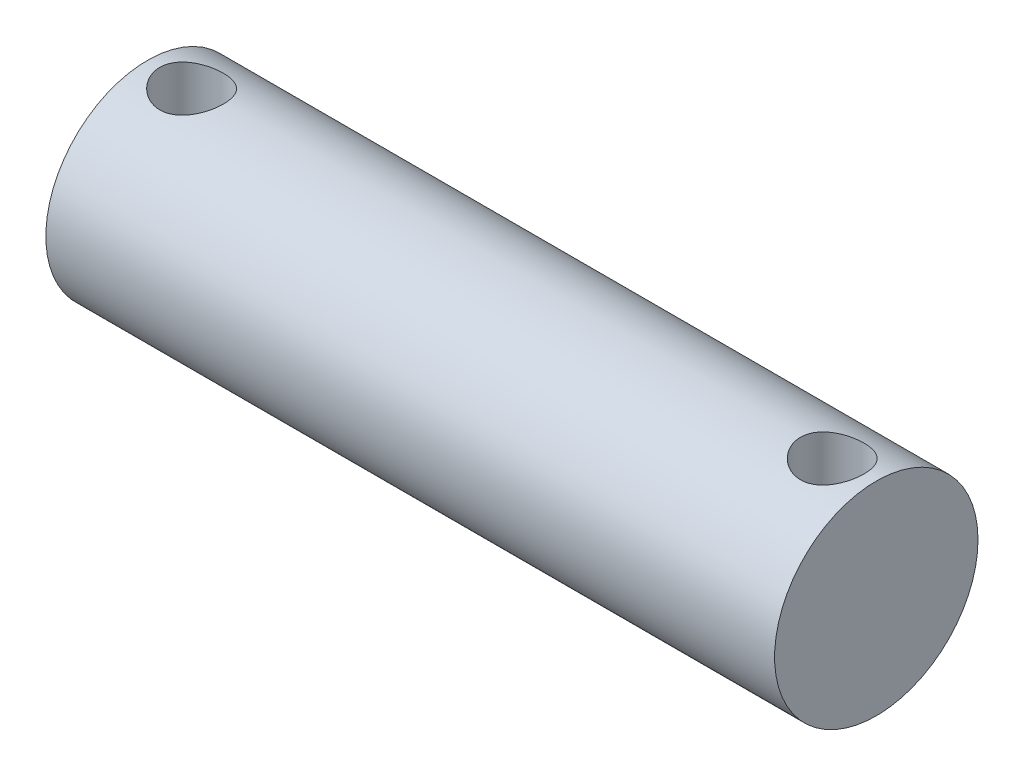
ISO-10303-21;
HEADER;
FILE_DESCRIPTION(('STEP AP214'),'2;1');
FILE_NAME('part.step','',(''),(''),'','','');
FILE_SCHEMA(('AUTOMOTIVE_DESIGN { 1 0 10303 214 1 1 1 1 }'));
ENDSEC;
DATA;
#1=APPLICATION_CONTEXT('core data for automotive mechanical design processes');
#2=APPLICATION_PROTOCOL_DEFINITION('international standard','automotive_design',2000,#1);
#3=PRODUCT_CONTEXT('',#1,'mechanical');
#4=PRODUCT('Part','Part','',(#3));
#5=PRODUCT_RELATED_PRODUCT_CATEGORY('part','',(#4));
#6=PRODUCT_DEFINITION_FORMATION('','',#4);
#7=PRODUCT_DEFINITION_CONTEXT('part definition',#1,'design');
#8=PRODUCT_DEFINITION('design','',#6,#7);
#9=PRODUCT_DEFINITION_SHAPE('','',#8);
#10=(LENGTH_UNIT() NAMED_UNIT(*) SI_UNIT(.MILLI.,.METRE.));
#11=(NAMED_UNIT(*) PLANE_ANGLE_UNIT() SI_UNIT($,.RADIAN.));
#12=(NAMED_UNIT(*) SI_UNIT($,.STERADIAN.) SOLID_ANGLE_UNIT());
#13=UNCERTAINTY_MEASURE_WITH_UNIT(LENGTH_MEASURE(1.E-05),#10,'distance_accuracy_value','');
#14=(GEOMETRIC_REPRESENTATION_CONTEXT(3) GLOBAL_UNCERTAINTY_ASSIGNED_CONTEXT((#13)) GLOBAL_UNIT_ASSIGNED_CONTEXT((#10,
#11,#12)) REPRESENTATION_CONTEXT('',''));
#15=CARTESIAN_POINT('',(0.,0.,0.));
#16=DIRECTION('',(0.,0.,1.));
#17=DIRECTION('',(1.,0.,0.));
#18=AXIS2_PLACEMENT_3D('',#15,#16,#17);
#19=CARTESIAN_POINT('',(91.,0.,0.));
#20=DIRECTION('',(-1.,0.,0.));
#21=DIRECTION('',(0.,0.,1.));
#22=AXIS2_PLACEMENT_3D('',#19,#20,#21);
#23=CYLINDRICAL_SURFACE('',#22,12.7);
#24=CARTESIAN_POINT('',(85.5,-12.0639555468967,3.96875));
#25=CARTESIAN_POINT('',(85.7170018396472,-12.0639568842915,3.9687485325165));
#26=CARTESIAN_POINT('',(85.9340185906327,-12.0698746252851,3.95089185662996));
#27=CARTESIAN_POINT('',(86.3616764607871,-12.0928015382143,3.88014131899213));
#28=CARTESIAN_POINT('',(86.5723158409246,-12.1098137074621,3.82723798884486));
#29=CARTESIAN_POINT('',(86.9809625636341,-12.1528185580417,3.688390776098));
#30=CARTESIAN_POINT('',(87.1789915401105,-12.1787953399196,3.60250535963949));
#31=CARTESIAN_POINT('',(87.5578848093683,-12.2367803974434,3.40032702499773));
#32=CARTESIAN_POINT('',(87.7387460621234,-12.2687897383379,3.28402873500381));
#33=CARTESIAN_POINT('',(88.0843829042918,-12.3364665534787,3.02004752422577));
#34=CARTESIAN_POINT('',(88.2484819599593,-12.3722169174668,2.87149984411226));
#35=CARTESIAN_POINT('',(88.5498923419392,-12.4426423060657,2.54908699749619));
#36=CARTESIAN_POINT('',(88.6871999277999,-12.4773171799559,2.37521830174644));
#37=CARTESIAN_POINT('',(88.9341151250607,-12.542632820135,2.00223727216642));
#38=CARTESIAN_POINT('',(89.0430260096649,-12.5731646098683,1.8026429419513));
#39=CARTESIAN_POINT('',(89.2254689582914,-12.6257860206983,1.38685343930955));
#40=CARTESIAN_POINT('',(89.299009337925,-12.6478776258325,1.17066218269639));
#41=CARTESIAN_POINT('',(89.4063648317082,-12.6805428323124,0.734899333367359));
#42=CARTESIAN_POINT('',(89.4413362555764,-12.6914509627465,0.515638146611583));
#43=CARTESIAN_POINT('',(89.4742247999392,-12.7017016690635,0.0741070844008447));
#44=CARTESIAN_POINT('',(89.4721503435893,-12.7010468740197,-0.148162095639555));
#45=CARTESIAN_POINT('',(89.4317666742146,-12.6884784372079,-0.581261475126279));
#46=CARTESIAN_POINT('',(89.3947109573462,-12.6769542933654,-0.792221663947061));
#47=CARTESIAN_POINT('',(89.2874734066134,-12.6444210713078,-1.20476347612921));
#48=CARTESIAN_POINT('',(89.21728941235,-12.6234113745139,-1.40634448690293));
#49=CARTESIAN_POINT('',(89.0449821496875,-12.5737448464102,-1.79729797751631));
#50=CARTESIAN_POINT('',(88.9424784828133,-12.5449975673293,-1.98649083785201));
#51=CARTESIAN_POINT('',(88.7087467584371,-12.4828847037847,-2.34538047290818));
#52=CARTESIAN_POINT('',(88.5775114372341,-12.4495179522495,-2.51507230096488));
#53=CARTESIAN_POINT('',(88.2836062095093,-12.3800765457896,-2.83761719258919));
#54=CARTESIAN_POINT('',(88.1198542064422,-12.3439469905188,-2.98947379336683));
#55=CARTESIAN_POINT('',(87.7688705516943,-12.2742520403678,-3.26386743274753));
#56=CARTESIAN_POINT('',(87.5816361383756,-12.2406869478284,-3.386401017894));
#57=CARTESIAN_POINT('',(87.1861870364089,-12.1796443805944,-3.59982976435593));
#58=CARTESIAN_POINT('',(86.9777611764537,-12.1522391668376,-3.6903558622175));
#59=CARTESIAN_POINT('',(86.5475611134016,-12.1074670626035,-3.83471248377108));
#60=CARTESIAN_POINT('',(86.3257917374329,-12.090096565806,-3.8885561917888));
#61=CARTESIAN_POINT('',(85.8847466505676,-12.0681611381736,-3.95609715466836));
#62=CARTESIAN_POINT('',(85.6657286619535,-12.0631098080018,-3.97132030073624));
#63=CARTESIAN_POINT('',(85.2282525707529,-12.0650342093526,-3.96547163781534));
#64=CARTESIAN_POINT('',(85.0097943868786,-12.0720080824823,-3.94440543703716));
#65=CARTESIAN_POINT('',(84.5862086581285,-12.0967169001143,-3.86793973404382));
#66=CARTESIAN_POINT('',(84.3808783048144,-12.1141348427389,-3.81355063934748));
#67=CARTESIAN_POINT('',(83.9822808104132,-12.1574333727714,-3.67316936373721));
#68=CARTESIAN_POINT('',(83.7890156428254,-12.1833153403409,-3.58717202843405));
#69=CARTESIAN_POINT('',(83.4139008264745,-12.2415471339902,-3.38320096332414));
#70=CARTESIAN_POINT('',(83.2325375054929,-12.2740611607997,-3.26438093276173));
#71=CARTESIAN_POINT('',(82.891768150301,-12.3415535798866,-2.99912534755838));
#72=CARTESIAN_POINT('',(82.7323678386621,-12.3765326108584,-2.85268261914323));
#73=CARTESIAN_POINT('',(82.4332345882268,-12.4467679551153,-2.52911910911771));
#74=CARTESIAN_POINT('',(82.2945905290059,-12.4819756800704,-2.35097843807856));
#75=CARTESIAN_POINT('',(82.049120937455,-12.5472526500367,-1.97310865744319));
#76=CARTESIAN_POINT('',(81.9422939476875,-12.5773221303875,-1.77338053726987));
#77=CARTESIAN_POINT('',(81.7645154641524,-12.6287629037303,-1.35923503657856));
#78=CARTESIAN_POINT('',(81.6933042610963,-12.6501969360681,-1.14493733510092));
#79=CARTESIAN_POINT('',(81.5881696899777,-12.6822277040923,-0.706619281629031));
#80=CARTESIAN_POINT('',(81.5542346534099,-12.6928278310283,-0.482601994980625));
#81=CARTESIAN_POINT('',(81.525563569445,-12.7017717580917,-0.0412271738602467));
#82=CARTESIAN_POINT('',(81.5292546707078,-12.7006073586846,0.176019434430215));
#83=CARTESIAN_POINT('',(81.5719275000796,-12.6873310540733,0.60665747960632));
#84=CARTESIAN_POINT('',(81.6109069272744,-12.6752198626356,0.820049166920138));
#85=CARTESIAN_POINT('',(81.7220484792807,-12.6415663743223,1.23429750117652));
#86=CARTESIAN_POINT('',(81.7937895049091,-12.6201439227365,1.4352775410771));
#87=CARTESIAN_POINT('',(81.9680373763869,-12.5700772724174,1.82244500096279));
#88=CARTESIAN_POINT('',(82.0705494991656,-12.5414318351506,2.00862987679648));
#89=CARTESIAN_POINT('',(82.3074510077436,-12.4786992260472,2.36779338152877));
#90=CARTESIAN_POINT('',(82.4428036838231,-12.444460434593,2.54010987739363));
#91=CARTESIAN_POINT('',(82.739845148983,-12.3748398853692,2.86010601269284));
#92=CARTESIAN_POINT('',(82.9015418178926,-12.3394577881682,3.00777825387572));
#93=CARTESIAN_POINT('',(83.2531024104955,-12.2701650893337,3.27923099268228));
#94=CARTESIAN_POINT('',(83.4437220548951,-12.2363420774147,3.40205783883209));
#95=CARTESIAN_POINT('',(83.8439140318545,-12.1754939776251,3.61379994626557));
#96=CARTESIAN_POINT('',(84.0534786564796,-12.148466141849,3.70272892306259));
#97=CARTESIAN_POINT('',(84.4672443099741,-12.1064832939804,3.83765997883641));
#98=CARTESIAN_POINT('',(84.6703805881587,-12.090695752639,3.88667433985248));
#99=CARTESIAN_POINT('',(85.0823409169064,-12.0694325058162,3.95221605466117));
#100=CARTESIAN_POINT('',(85.2911635533148,-12.0639542598257,3.96875141226472));
#101=CARTESIAN_POINT('',(85.5,-12.0639555468967,3.96875));
#102=B_SPLINE_CURVE_WITH_KNOTS('',3,(#24,#25,#26,#27,#28,#29,#30,#31,#32,#33,#34,#35,#36,#37,
#38,#39,#40,#41,#42,#43,#44,#45,#46,#47,#48,#49,#50,#51,#52,#53,#54,#55,#56,#57,#58,#59,#60,#61,
#62,#63,#64,#65,#66,#67,#68,#69,#70,#71,#72,#73,#74,#75,#76,#77,#78,#79,#80,#81,#82,#83,#84,#85,
#86,#87,#88,#89,#90,#91,#92,#93,#94,#95,#96,#97,#98,#99,#100,#101),.UNSPECIFIED.,.T.,.F.,(4,2,2,
2,2,2,2,2,2,2,2,2,2,2,2,2,2,2,2,2,2,2,2,2,2,2,2,2,2,2,2,2,2,2,2,2,2,2,4),(0.,0.650234086716464,
1.30064391591467,1.9499060700765,2.59928298063673,3.26888730748912,3.93858505338066,
4.62342934734855,5.30811255551903,5.97165820002821,6.63505297547886,7.2755437092896,
7.91607621728547,8.56444834631701,9.21298458114372,9.88854826126038,10.5641914653574,
11.2473889522044,11.9303407555771,12.5858566319692,13.2412712130333,13.8777336124858,
14.5142998466167,15.1691217226574,15.8241138944544,16.5062515255927,17.1883579053947,
17.8654150975664,18.5422602910408,19.1909319775322,19.839561371558,20.4800786269208,
21.1207057872722,21.7830620061678,22.4456167093443,23.1301225072564,23.8143510505986,
24.4402722513688,25.066039186821),.UNSPECIFIED.);
#103=CARTESIAN_POINT('',(85.5,-12.0639555468967,3.96875));
#104=VERTEX_POINT('',#103);
#105=EDGE_CURVE('E35',#104,#104,#102,.T.);
#106=ORIENTED_EDGE('',*,*,#105,.T.);
#107=EDGE_LOOP('',(#106));
#108=FACE_BOUND('',#107,.T.);
#109=CARTESIAN_POINT('',(85.5,12.0639555468967,3.96875));
#110=CARTESIAN_POINT('',(85.2829981603529,12.0639568842915,3.9687485325165));
#111=CARTESIAN_POINT('',(85.0659814093673,12.0698746252851,3.95089185662996));
#112=CARTESIAN_POINT('',(84.638323539213,12.0928015382143,3.88014131899213));
#113=CARTESIAN_POINT('',(84.4276841590754,12.1098137074621,3.82723798884486));
#114=CARTESIAN_POINT('',(84.0190374363659,12.1528185580417,3.688390776098));
#115=CARTESIAN_POINT('',(83.8210084598895,12.1787953399196,3.60250535963949));
#116=CARTESIAN_POINT('',(83.4421151906318,12.2367803974434,3.40032702499773));
#117=CARTESIAN_POINT('',(83.2612539378766,12.2687897383379,3.28402873500381));
#118=CARTESIAN_POINT('',(82.9156170957082,12.3364665534787,3.02004752422577));
#119=CARTESIAN_POINT('',(82.7515180400408,12.3722169174668,2.87149984411226));
#120=CARTESIAN_POINT('',(82.4501076580608,12.4426423060657,2.54908699749619));
#121=CARTESIAN_POINT('',(82.3128000722001,12.4773171799559,2.37521830174644));
#122=CARTESIAN_POINT('',(82.0658848749393,12.542632820135,2.00223727216642));
#123=CARTESIAN_POINT('',(81.9569739903351,12.5731646098683,1.8026429419513));
#124=CARTESIAN_POINT('',(81.7745310417086,12.6257860206983,1.38685343930955));
#125=CARTESIAN_POINT('',(81.7009906620751,12.6478776258325,1.17066218269639));
#126=CARTESIAN_POINT('',(81.5936351682918,12.6805428323124,0.73489933336736));
#127=CARTESIAN_POINT('',(81.5586637444236,12.6914509627465,0.515638146611583));
#128=CARTESIAN_POINT('',(81.5257752000609,12.7017016690635,0.0741070844008444));
#129=CARTESIAN_POINT('',(81.5278496564108,12.7010468740197,-0.148162095639555));
#130=CARTESIAN_POINT('',(81.5682333257854,12.6884784372079,-0.581261475126278));
#131=CARTESIAN_POINT('',(81.6052890426538,12.6769542933654,-0.792221663947059));
#132=CARTESIAN_POINT('',(81.7125265933866,12.6444210713078,-1.20476347612921));
#133=CARTESIAN_POINT('',(81.78271058765,12.6234113745139,-1.40634448690293));
#134=CARTESIAN_POINT('',(81.9550178503125,12.5737448464102,-1.79729797751631));
#135=CARTESIAN_POINT('',(82.0575215171868,12.5449975673293,-1.98649083785201));
#136=CARTESIAN_POINT('',(82.2912532415629,12.4828847037847,-2.34538047290818));
#137=CARTESIAN_POINT('',(82.4224885627659,12.4495179522495,-2.51507230096488));
#138=CARTESIAN_POINT('',(82.7163937904907,12.3800765457896,-2.83761719258919));
#139=CARTESIAN_POINT('',(82.8801457935578,12.3439469905188,-2.98947379336683));
#140=CARTESIAN_POINT('',(83.2311294483057,12.2742520403678,-3.26386743274753));
#141=CARTESIAN_POINT('',(83.4183638616244,12.2406869478284,-3.386401017894));
#142=CARTESIAN_POINT('',(83.8138129635911,12.1796443805944,-3.59982976435594));
#143=CARTESIAN_POINT('',(84.0222388235464,12.1522391668376,-3.69035586221751));
#144=CARTESIAN_POINT('',(84.4524388865984,12.1074670626035,-3.83471248377109));
#145=CARTESIAN_POINT('',(84.6742082625672,12.090096565806,-3.8885561917888));
#146=CARTESIAN_POINT('',(85.1152533494324,12.0681611381736,-3.95609715466836));
#147=CARTESIAN_POINT('',(85.3342713380466,12.0631098080018,-3.97132030073624));
#148=CARTESIAN_POINT('',(85.7717474292471,12.0650342093526,-3.96547163781534));
#149=CARTESIAN_POINT('',(85.9902056131215,12.0720080824823,-3.94440543703716));
#150=CARTESIAN_POINT('',(86.4137913418715,12.0967169001143,-3.86793973404382));
#151=CARTESIAN_POINT('',(86.6191216951856,12.1141348427389,-3.81355063934748));
#152=CARTESIAN_POINT('',(87.0177191895868,12.1574333727713,-3.67316936373722));
#153=CARTESIAN_POINT('',(87.2109843571746,12.1833153403409,-3.58717202843405));
#154=CARTESIAN_POINT('',(87.5860991735255,12.2415471339902,-3.38320096332414));
#155=CARTESIAN_POINT('',(87.7674624945071,12.2740611607997,-3.26438093276173));
#156=CARTESIAN_POINT('',(88.108231849699,12.3415535798866,-2.99912534755837));
#157=CARTESIAN_POINT('',(88.2676321613379,12.3765326108584,-2.85268261914323));
#158=CARTESIAN_POINT('',(88.5667654117732,12.4467679551153,-2.52911910911771));
#159=CARTESIAN_POINT('',(88.7054094709941,12.4819756800704,-2.35097843807856));
#160=CARTESIAN_POINT('',(88.950879062545,12.5472526500367,-1.97310865744319));
#161=CARTESIAN_POINT('',(89.0577060523125,12.5773221303875,-1.77338053726987));
#162=CARTESIAN_POINT('',(89.2354845358476,12.6287629037303,-1.35923503657856));
#163=CARTESIAN_POINT('',(89.3066957389037,12.6501969360681,-1.14493733510092));
#164=CARTESIAN_POINT('',(89.4118303100223,12.6822277040923,-0.706619281629031));
#165=CARTESIAN_POINT('',(89.4457653465901,12.6928278310283,-0.482601994980625));
#166=CARTESIAN_POINT('',(89.4744364305551,12.7017717580917,-0.0412271738602467));
#167=CARTESIAN_POINT('',(89.4707453292922,12.7006073586846,0.176019434430215));
#168=CARTESIAN_POINT('',(89.4280724999204,12.6873310540733,0.60665747960632));
#169=CARTESIAN_POINT('',(89.3890930727256,12.6752198626356,0.820049166920138));
#170=CARTESIAN_POINT('',(89.2779515207193,12.6415663743223,1.23429750117652));
#171=CARTESIAN_POINT('',(89.2062104950909,12.6201439227365,1.4352775410771));
#172=CARTESIAN_POINT('',(89.0319626236131,12.5700772724174,1.82244500096279));
#173=CARTESIAN_POINT('',(88.9294505008344,12.5414318351506,2.00862987679648));
#174=CARTESIAN_POINT('',(88.6925489922564,12.4786992260472,2.36779338152877));
#175=CARTESIAN_POINT('',(88.5571963161769,12.444460434593,2.54010987739364));
#176=CARTESIAN_POINT('',(88.260154851017,12.3748398853692,2.86010601269285));
#177=CARTESIAN_POINT('',(88.0984581821074,12.3394577881682,3.00777825387572));
#178=CARTESIAN_POINT('',(87.7468975895045,12.2701650893337,3.27923099268228));
#179=CARTESIAN_POINT('',(87.5562779451049,12.2363420774147,3.40205783883209));
#180=CARTESIAN_POINT('',(87.1560859681455,12.1754939776251,3.61379994626557));
#181=CARTESIAN_POINT('',(86.9465213435204,12.148466141849,3.70272892306259));
#182=CARTESIAN_POINT('',(86.5327556900259,12.1064832939804,3.83765997883641));
#183=CARTESIAN_POINT('',(86.3296194118413,12.090695752639,3.88667433985248));
#184=CARTESIAN_POINT('',(85.9176590830937,12.0694325058162,3.95221605466117));
#185=CARTESIAN_POINT('',(85.7088364466853,12.0639542598257,3.96875141226472));
#186=CARTESIAN_POINT('',(85.5,12.0639555468967,3.96875));
#187=B_SPLINE_CURVE_WITH_KNOTS('',3,(#109,#110,#111,#112,#113,#114,#115,#116,#117,#118,#119,
#120,#121,#122,#123,#124,#125,#126,#127,#128,#129,#130,#131,#132,#133,#134,#135,#136,#137,#138,
#139,#140,#141,#142,#143,#144,#145,#146,#147,#148,#149,#150,#151,#152,#153,#154,#155,#156,#157,
#158,#159,#160,#161,#162,#163,#164,#165,#166,#167,#168,#169,#170,#171,#172,#173,#174,#175,#176,
#177,#178,#179,#180,#181,#182,#183,#184,#185,#186),.UNSPECIFIED.,.T.,.F.,(4,2,2,2,2,2,2,2,2,2,2,
2,2,2,2,2,2,2,2,2,2,2,2,2,2,2,2,2,2,2,2,2,2,2,2,2,2,2,4),(0.,0.650234086716464,1.30064391591467,
1.9499060700765,2.59928298063673,3.26888730748912,3.93858505338066,4.62342934734854,
5.30811255551903,5.9716582000282,6.63505297547885,7.27554370928959,7.91607621728547,
8.56444834631701,9.21298458114372,9.88854826126038,10.5641914653574,11.2473889522045,
11.9303407555771,12.5858566319692,13.2412712130333,13.8777336124858,14.5142998466167,
15.1691217226574,15.8241138944544,16.5062515255927,17.1883579053947,17.8654150975664,
18.5422602910408,19.1909319775322,19.839561371558,20.4800786269208,21.1207057872722,
21.7830620061678,22.4456167093443,23.1301225072564,23.8143510505986,24.4402722513687,
25.066039186821),.UNSPECIFIED.);
#188=CARTESIAN_POINT('',(85.5,12.0639555468967,3.96875));
#189=VERTEX_POINT('',#188);
#190=EDGE_CURVE('E84',#189,#189,#187,.T.);
#191=ORIENTED_EDGE('',*,*,#190,.T.);
#192=EDGE_LOOP('',(#191));
#193=FACE_BOUND('',#192,.T.);
#194=CARTESIAN_POINT('',(5.5,-12.0639555468967,3.96875));
#195=CARTESIAN_POINT('',(5.71700183964714,-12.0639568842915,3.96874853251649));
#196=CARTESIAN_POINT('',(5.93401859063266,-12.0698746252851,3.95089185662995));
#197=CARTESIAN_POINT('',(6.36167646078704,-12.0928015382143,3.88014131899213));
#198=CARTESIAN_POINT('',(6.57231584092461,-12.1098137074621,3.82723798884485));
#199=CARTESIAN_POINT('',(6.9809625636341,-12.1528185580417,3.68839077609799));
#200=CARTESIAN_POINT('',(7.17899154011053,-12.1787953399196,3.60250535963949));
#201=CARTESIAN_POINT('',(7.55788480936824,-12.2367803974434,3.40032702499773));
#202=CARTESIAN_POINT('',(7.73874606212339,-12.2687897383379,3.28402873500381));
#203=CARTESIAN_POINT('',(8.08438290429182,-12.3364665534787,3.02004752422578));
#204=CARTESIAN_POINT('',(8.24848195995925,-12.3722169174668,2.87149984411227));
#205=CARTESIAN_POINT('',(8.54989234193916,-12.4426423060657,2.5490869974962));
#206=CARTESIAN_POINT('',(8.68719992779988,-12.4773171799559,2.37521830174644));
#207=CARTESIAN_POINT('',(8.9341151250607,-12.542632820135,2.00223727216643));
#208=CARTESIAN_POINT('',(9.04302600966487,-12.5731646098683,1.8026429419513));
#209=CARTESIAN_POINT('',(9.22546895829137,-12.6257860206983,1.38685343930956));
#210=CARTESIAN_POINT('',(9.29900933792493,-12.6478776258325,1.17066218269639));
#211=CARTESIAN_POINT('',(9.40636483170819,-12.6805428323124,0.734899333367363));
#212=CARTESIAN_POINT('',(9.44133625557643,-12.6914509627465,0.515638146611587));
#213=CARTESIAN_POINT('',(9.47422479993914,-12.7017016690635,0.074107084400851));
#214=CARTESIAN_POINT('',(9.47215034358927,-12.7010468740197,-0.148162095639548));
#215=CARTESIAN_POINT('',(9.43176667421464,-12.6884784372079,-0.581261475126271));
#216=CARTESIAN_POINT('',(9.39471095734622,-12.6769542933654,-0.792221663947053));
#217=CARTESIAN_POINT('',(9.28747340661341,-12.6444210713078,-1.2047634761292));
#218=CARTESIAN_POINT('',(9.21728941234996,-12.6234113745139,-1.40634448690292));
#219=CARTESIAN_POINT('',(9.04498214968748,-12.5737448464102,-1.7972979775163));
#220=CARTESIAN_POINT('',(8.94247848281326,-12.5449975673293,-1.986490837852));
#221=CARTESIAN_POINT('',(8.70874675843714,-12.4828847037847,-2.34538047290818));
#222=CARTESIAN_POINT('',(8.57751143723408,-12.4495179522495,-2.51507230096487));
#223=CARTESIAN_POINT('',(8.28360620950933,-12.3800765457896,-2.83761719258918));
#224=CARTESIAN_POINT('',(8.11985420644223,-12.3439469905188,-2.98947379336682));
#225=CARTESIAN_POINT('',(7.76887055169429,-12.2742520403678,-3.26386743274752));
#226=CARTESIAN_POINT('',(7.58163613837563,-12.2406869478284,-3.38640101789399));
#227=CARTESIAN_POINT('',(7.18618703640896,-12.1796443805944,-3.59982976435593));
#228=CARTESIAN_POINT('',(6.97776117645367,-12.1522391668376,-3.69035586221749));
#229=CARTESIAN_POINT('',(6.54756111340163,-12.1074670626035,-3.83471248377107));
#230=CARTESIAN_POINT('',(6.32579173743286,-12.090096565806,-3.8885561917888));
#231=CARTESIAN_POINT('',(5.88474665056758,-12.0681611381736,-3.95609715466835));
#232=CARTESIAN_POINT('',(5.66572866195345,-12.0631098080018,-3.97132030073623));
#233=CARTESIAN_POINT('',(5.22825257075294,-12.0650342093526,-3.96547163781533));
#234=CARTESIAN_POINT('',(5.00979438687856,-12.0720080824823,-3.94440543703716));
#235=CARTESIAN_POINT('',(4.58620865812856,-12.0967169001143,-3.86793973404382));
#236=CARTESIAN_POINT('',(4.38087830481441,-12.1141348427389,-3.81355063934748));
#237=CARTESIAN_POINT('',(3.98228081041323,-12.1574333727714,-3.67316936373722));
#238=CARTESIAN_POINT('',(3.7890156428254,-12.1833153403409,-3.58717202843405));
#239=CARTESIAN_POINT('',(3.41390082647451,-12.2415471339902,-3.38320096332414));
#240=CARTESIAN_POINT('',(3.23253750549289,-12.2740611607997,-3.26438093276173));
#241=CARTESIAN_POINT('',(2.89176815030096,-12.3415535798866,-2.99912534755837));
#242=CARTESIAN_POINT('',(2.73236783866207,-12.3765326108584,-2.85268261914323));
#243=CARTESIAN_POINT('',(2.4332345882268,-12.4467679551153,-2.5291191091177));
#244=CARTESIAN_POINT('',(2.29459052900593,-12.4819756800704,-2.35097843807856));
#245=CARTESIAN_POINT('',(2.04912093745502,-12.5472526500367,-1.97310865744319));
#246=CARTESIAN_POINT('',(1.94229394768746,-12.5773221303875,-1.77338053726988));
#247=CARTESIAN_POINT('',(1.76451546415241,-12.6287629037303,-1.35923503657857));
#248=CARTESIAN_POINT('',(1.69330426109631,-12.6501969360681,-1.14493733510093));
#249=CARTESIAN_POINT('',(1.58816968997768,-12.6822277040923,-0.706619281629038));
#250=CARTESIAN_POINT('',(1.5542346534099,-12.6928278310283,-0.482601994980634));
#251=CARTESIAN_POINT('',(1.52556356944495,-12.7017717580917,-0.041227173860258));
#252=CARTESIAN_POINT('',(1.52925467070784,-12.7006073586846,0.176019434430203));
#253=CARTESIAN_POINT('',(1.57192750007961,-12.6873310540733,0.606657479606308));
#254=CARTESIAN_POINT('',(1.61090692727443,-12.6752198626356,0.820049166920125));
#255=CARTESIAN_POINT('',(1.72204847928072,-12.6415663743223,1.23429750117651));
#256=CARTESIAN_POINT('',(1.79378950490905,-12.6201439227365,1.4352775410771));
#257=CARTESIAN_POINT('',(1.96803737638691,-12.5700772724174,1.82244500096279));
#258=CARTESIAN_POINT('',(2.07054949916563,-12.5414318351506,2.00862987679648));
#259=CARTESIAN_POINT('',(2.30745100774359,-12.4786992260472,2.36779338152876));
#260=CARTESIAN_POINT('',(2.44280368382311,-12.444460434593,2.54010987739362));
#261=CARTESIAN_POINT('',(2.739845148983,-12.3748398853692,2.86010601269283));
#262=CARTESIAN_POINT('',(2.90154181789255,-12.3394577881682,3.00777825387571));
#263=CARTESIAN_POINT('',(3.25310241049549,-12.2701650893337,3.27923099268227));
#264=CARTESIAN_POINT('',(3.44372205489512,-12.2363420774147,3.40205783883207));
#265=CARTESIAN_POINT('',(3.84391403185452,-12.1754939776251,3.61379994626556));
#266=CARTESIAN_POINT('',(4.05347865647954,-12.148466141849,3.70272892306258));
#267=CARTESIAN_POINT('',(4.46724430997408,-12.1064832939804,3.8376599788364));
#268=CARTESIAN_POINT('',(4.67038058815872,-12.090695752639,3.88667433985248));
#269=CARTESIAN_POINT('',(5.08234091690635,-12.0694325058162,3.95221605466116));
#270=CARTESIAN_POINT('',(5.29116355331476,-12.0639542598257,3.96875141226471));
#271=CARTESIAN_POINT('',(5.5,-12.0639555468967,3.96875));
#272=B_SPLINE_CURVE_WITH_KNOTS('',3,(#194,#195,#196,#197,#198,#199,#200,#201,#202,#203,#204,
#205,#206,#207,#208,#209,#210,#211,#212,#213,#214,#215,#216,#217,#218,#219,#220,#221,#222,#223,
#224,#225,#226,#227,#228,#229,#230,#231,#232,#233,#234,#235,#236,#237,#238,#239,#240,#241,#242,
#243,#244,#245,#246,#247,#248,#249,#250,#251,#252,#253,#254,#255,#256,#257,#258,#259,#260,#261,
#262,#263,#264,#265,#266,#267,#268,#269,#270,#271),.UNSPECIFIED.,.T.,.F.,(4,2,2,2,2,2,2,2,2,2,2,
2,2,2,2,2,2,2,2,2,2,2,2,2,2,2,2,2,2,2,2,2,2,2,2,2,2,2,4),(0.,0.650234086716456,1.30064391591466,
1.9499060700765,2.59928298063671,3.26888730748911,3.93858505338064,4.62342934734852,
5.30811255551902,5.97165820002819,6.63505297547884,7.27554370928958,7.91607621728546,
8.56444834631698,9.2129845811437,9.88854826126035,10.5641914653574,11.2473889522044,
11.9303407555771,12.5858566319692,13.2412712130333,13.8777336124857,14.5142998466166,
15.1691217226573,15.8241138944544,16.5062515255927,17.1883579053947,17.8654150975664,
18.5422602910408,19.1909319775321,19.8395613715579,20.4800786269208,21.1207057872722,
21.7830620061678,22.4456167093443,23.1301225072563,23.8143510505986,24.4402722513687,
25.066039186821),.UNSPECIFIED.);
#273=CARTESIAN_POINT('',(5.5,-12.0639555468967,3.96875));
#274=VERTEX_POINT('',#273);
#275=EDGE_CURVE('E47',#274,#274,#272,.T.);
#276=ORIENTED_EDGE('',*,*,#275,.T.);
#277=EDGE_LOOP('',(#276));
#278=FACE_BOUND('',#277,.T.);
#279=CARTESIAN_POINT('',(5.5,12.0639555468967,3.96875));
#280=CARTESIAN_POINT('',(5.28299816035286,12.0639568842915,3.96874853251649));
#281=CARTESIAN_POINT('',(5.06598140936734,12.0698746252851,3.95089185662995));
#282=CARTESIAN_POINT('',(4.63832353921296,12.0928015382143,3.88014131899213));
#283=CARTESIAN_POINT('',(4.42768415907539,12.1098137074621,3.82723798884485));
#284=CARTESIAN_POINT('',(4.0190374363659,12.1528185580417,3.68839077609799));
#285=CARTESIAN_POINT('',(3.82100845988947,12.1787953399196,3.60250535963949));
#286=CARTESIAN_POINT('',(3.44211519063176,12.2367803974434,3.40032702499773));
#287=CARTESIAN_POINT('',(3.26125393787661,12.2687897383379,3.28402873500381));
#288=CARTESIAN_POINT('',(2.91561709570818,12.3364665534787,3.02004752422578));
#289=CARTESIAN_POINT('',(2.75151804004075,12.3722169174668,2.87149984411226));
#290=CARTESIAN_POINT('',(2.45010765806083,12.4426423060657,2.54908699749619));
#291=CARTESIAN_POINT('',(2.31280007220011,12.4773171799559,2.37521830174644));
#292=CARTESIAN_POINT('',(2.0658848749393,12.542632820135,2.00223727216642));
#293=CARTESIAN_POINT('',(1.95697399033512,12.5731646098683,1.8026429419513));
#294=CARTESIAN_POINT('',(1.77453104170863,12.6257860206983,1.38685343930956));
#295=CARTESIAN_POINT('',(1.70099066207507,12.6478776258325,1.17066218269639));
#296=CARTESIAN_POINT('',(1.59363516829181,12.6805428323124,0.734899333367361));
#297=CARTESIAN_POINT('',(1.55866374442357,12.6914509627465,0.515638146611586));
#298=CARTESIAN_POINT('',(1.52577520006086,12.7017016690635,0.07410708440085));
#299=CARTESIAN_POINT('',(1.52784965641073,12.7010468740197,-0.148162095639549));
#300=CARTESIAN_POINT('',(1.56823332578536,12.6884784372079,-0.581261475126272));
#301=CARTESIAN_POINT('',(1.60528904265378,12.6769542933654,-0.792221663947054));
#302=CARTESIAN_POINT('',(1.71252659338659,12.6444210713078,-1.2047634761292));
#303=CARTESIAN_POINT('',(1.78271058765004,12.6234113745139,-1.40634448690292));
#304=CARTESIAN_POINT('',(1.95501785031252,12.5737448464102,-1.7972979775163));
#305=CARTESIAN_POINT('',(2.05752151718674,12.5449975673293,-1.986490837852));
#306=CARTESIAN_POINT('',(2.29125324156286,12.4828847037847,-2.34538047290818));
#307=CARTESIAN_POINT('',(2.42248856276592,12.4495179522495,-2.51507230096487));
#308=CARTESIAN_POINT('',(2.71639379049067,12.3800765457896,-2.83761719258918));
#309=CARTESIAN_POINT('',(2.88014579355777,12.3439469905188,-2.98947379336682));
#310=CARTESIAN_POINT('',(3.23112944830571,12.2742520403678,-3.26386743274752));
#311=CARTESIAN_POINT('',(3.41836386162437,12.2406869478284,-3.38640101789399));
#312=CARTESIAN_POINT('',(3.81381296359104,12.1796443805944,-3.59982976435593));
#313=CARTESIAN_POINT('',(4.02223882354633,12.1522391668376,-3.69035586221749));
#314=CARTESIAN_POINT('',(4.45243888659837,12.1074670626035,-3.83471248377107));
#315=CARTESIAN_POINT('',(4.67420826256714,12.090096565806,-3.8885561917888));
#316=CARTESIAN_POINT('',(5.11525334943242,12.0681611381736,-3.95609715466836));
#317=CARTESIAN_POINT('',(5.33427133804655,12.0631098080018,-3.97132030073623));
#318=CARTESIAN_POINT('',(5.77174742924706,12.0650342093526,-3.96547163781533));
#319=CARTESIAN_POINT('',(5.99020561312144,12.0720080824823,-3.94440543703716));
#320=CARTESIAN_POINT('',(6.41379134187144,12.0967169001143,-3.86793973404382));
#321=CARTESIAN_POINT('',(6.61912169518559,12.1141348427389,-3.81355063934748));
#322=CARTESIAN_POINT('',(7.01771918958677,12.1574333727713,-3.67316936373722));
#323=CARTESIAN_POINT('',(7.2109843571746,12.1833153403409,-3.58717202843405));
#324=CARTESIAN_POINT('',(7.58609917352549,12.2415471339902,-3.38320096332414));
#325=CARTESIAN_POINT('',(7.76746249450711,12.2740611607997,-3.26438093276173));
#326=CARTESIAN_POINT('',(8.10823184969904,12.3415535798866,-2.99912534755837));
#327=CARTESIAN_POINT('',(8.26763216133793,12.3765326108584,-2.85268261914323));
#328=CARTESIAN_POINT('',(8.5667654117732,12.4467679551153,-2.5291191091177));
#329=CARTESIAN_POINT('',(8.70540947099408,12.4819756800704,-2.35097843807856));
#330=CARTESIAN_POINT('',(8.95087906254498,12.5472526500367,-1.97310865744319));
#331=CARTESIAN_POINT('',(9.05770605231254,12.5773221303875,-1.77338053726988));
#332=CARTESIAN_POINT('',(9.23548453584759,12.6287629037303,-1.35923503657857));
#333=CARTESIAN_POINT('',(9.30669573890369,12.6501969360681,-1.14493733510092));
#334=CARTESIAN_POINT('',(9.41183031002232,12.6822277040923,-0.706619281629037));
#335=CARTESIAN_POINT('',(9.4457653465901,12.6928278310283,-0.482601994980632));
#336=CARTESIAN_POINT('',(9.47443643055505,12.7017717580917,-0.0412271738602566));
#337=CARTESIAN_POINT('',(9.47074532929216,12.7006073586846,0.176019434430205));
#338=CARTESIAN_POINT('',(9.42807249992039,12.6873310540733,0.606657479606309));
#339=CARTESIAN_POINT('',(9.38909307272557,12.6752198626356,0.820049166920126));
#340=CARTESIAN_POINT('',(9.27795152071927,12.6415663743223,1.23429750117651));
#341=CARTESIAN_POINT('',(9.20621049509095,12.6201439227365,1.4352775410771));
#342=CARTESIAN_POINT('',(9.03196262361309,12.5700772724174,1.82244500096279));
#343=CARTESIAN_POINT('',(8.92945050083437,12.5414318351506,2.00862987679648));
#344=CARTESIAN_POINT('',(8.69254899225641,12.4786992260472,2.36779338152876));
#345=CARTESIAN_POINT('',(8.55719631617689,12.444460434593,2.54010987739363));
#346=CARTESIAN_POINT('',(8.260154851017,12.3748398853692,2.86010601269284));
#347=CARTESIAN_POINT('',(8.09845818210745,12.3394577881682,3.00777825387571));
#348=CARTESIAN_POINT('',(7.74689758950451,12.2701650893337,3.27923099268227));
#349=CARTESIAN_POINT('',(7.55627794510488,12.2363420774147,3.40205783883207));
#350=CARTESIAN_POINT('',(7.15608596814548,12.1754939776251,3.61379994626556));
#351=CARTESIAN_POINT('',(6.94652134352045,12.148466141849,3.70272892306258));
#352=CARTESIAN_POINT('',(6.53275569002592,12.1064832939804,3.8376599788364));
#353=CARTESIAN_POINT('',(6.32961941184128,12.090695752639,3.88667433985248));
#354=CARTESIAN_POINT('',(5.91765908309364,12.0694325058162,3.95221605466116));
#355=CARTESIAN_POINT('',(5.70883644668524,12.0639542598257,3.96875141226471));
#356=CARTESIAN_POINT('',(5.5,12.0639555468967,3.96875));
#357=B_SPLINE_CURVE_WITH_KNOTS('',3,(#279,#280,#281,#282,#283,#284,#285,#286,#287,#288,#289,
#290,#291,#292,#293,#294,#295,#296,#297,#298,#299,#300,#301,#302,#303,#304,#305,#306,#307,#308,
#309,#310,#311,#312,#313,#314,#315,#316,#317,#318,#319,#320,#321,#322,#323,#324,#325,#326,#327,
#328,#329,#330,#331,#332,#333,#334,#335,#336,#337,#338,#339,#340,#341,#342,#343,#344,#345,#346,
#347,#348,#349,#350,#351,#352,#353,#354,#355,#356),.UNSPECIFIED.,.T.,.F.,(4,2,2,2,2,2,2,2,2,2,2,
2,2,2,2,2,2,2,2,2,2,2,2,2,2,2,2,2,2,2,2,2,2,2,2,2,2,2,4),(0.,0.650234086716456,1.30064391591466,
1.9499060700765,2.59928298063671,3.26888730748912,3.93858505338065,4.62342934734853,
5.30811255551902,5.97165820002819,6.63505297547884,7.27554370928958,7.91607621728546,
8.56444834631699,9.21298458114371,9.88854826126035,10.5641914653574,11.2473889522044,
11.9303407555771,12.5858566319692,13.2412712130333,13.8777336124857,14.5142998466166,
15.1691217226573,15.8241138944544,16.5062515255927,17.1883579053947,17.8654150975664,
18.5422602910408,19.1909319775321,19.8395613715579,20.4800786269208,21.1207057872722,
21.7830620061678,22.4456167093443,23.1301225072563,23.8143510505986,24.4402722513687,
25.0660391868209),.UNSPECIFIED.);
#358=CARTESIAN_POINT('',(5.5,12.0639555468967,3.96875));
#359=VERTEX_POINT('',#358);
#360=EDGE_CURVE('E50',#359,#359,#357,.T.);
#361=ORIENTED_EDGE('',*,*,#360,.T.);
#362=EDGE_LOOP('',(#361));
#363=FACE_BOUND('',#362,.T.);
#364=CARTESIAN_POINT('',(91.,0.,0.));
#365=DIRECTION('',(1.,0.,0.));
#366=DIRECTION('',(0.,0.,-1.));
#367=AXIS2_PLACEMENT_3D('',#364,#365,#366);
#368=CIRCLE('',#367,12.7);
#369=CARTESIAN_POINT('',(91.,0.,-12.7));
#370=VERTEX_POINT('',#369);
#371=EDGE_CURVE('E10',#370,#370,#368,.T.);
#372=ORIENTED_EDGE('',*,*,#371,.F.);
#373=EDGE_LOOP('',(#372));
#374=FACE_BOUND('',#373,.T.);
#375=CARTESIAN_POINT('',(0.,0.,0.));
#376=DIRECTION('',(1.,0.,0.));
#377=DIRECTION('',(0.,0.,-1.));
#378=AXIS2_PLACEMENT_3D('',#375,#376,#377);
#379=CIRCLE('',#378,12.7);
#380=CARTESIAN_POINT('',(0.,0.,-12.7));
#381=VERTEX_POINT('',#380);
#382=EDGE_CURVE('E42',#381,#381,#379,.T.);
#383=ORIENTED_EDGE('',*,*,#382,.T.);
#384=EDGE_LOOP('',(#383));
#385=FACE_BOUND('',#384,.T.);
#386=ADVANCED_FACE('F31',(#108,#193,#278,#363,#374,#385),#23,.T.);
#387=CARTESIAN_POINT('',(91.,0.,0.));
#388=DIRECTION('',(1.,0.,0.));
#389=DIRECTION('',(0.,0.,-1.));
#390=AXIS2_PLACEMENT_3D('',#387,#388,#389);
#391=PLANE('',#390);
#392=ORIENTED_EDGE('',*,*,#371,.T.);
#393=EDGE_LOOP('',(#392));
#394=FACE_BOUND('',#393,.T.);
#395=ADVANCED_FACE('F66',(#394),#391,.T.);
#396=CARTESIAN_POINT('',(0.,0.,0.));
#397=DIRECTION('',(1.,0.,0.));
#398=DIRECTION('',(0.,0.,-1.));
#399=AXIS2_PLACEMENT_3D('',#396,#397,#398);
#400=PLANE('',#399);
#401=ORIENTED_EDGE('',*,*,#382,.F.);
#402=EDGE_LOOP('',(#401));
#403=FACE_BOUND('',#402,.T.);
#404=ADVANCED_FACE('F63',(#403),#400,.F.);
#405=CARTESIAN_POINT('',(5.5,-20.,0.));
#406=DIRECTION('',(0.,1.,0.));
#407=DIRECTION('',(0.,0.,1.));
#408=AXIS2_PLACEMENT_3D('',#405,#406,#407);
#409=CYLINDRICAL_SURFACE('',#408,3.96875);
#410=ORIENTED_EDGE('',*,*,#360,.F.);
#411=EDGE_LOOP('',(#410));
#412=FACE_BOUND('',#411,.T.);
#413=ORIENTED_EDGE('',*,*,#275,.F.);
#414=EDGE_LOOP('',(#413));
#415=FACE_BOUND('',#414,.T.);
#416=ADVANCED_FACE('F58',(#412,#415),#409,.F.);
#417=CARTESIAN_POINT('',(85.5,-20.,0.));
#418=DIRECTION('',(0.,1.,0.));
#419=DIRECTION('',(0.,0.,1.));
#420=AXIS2_PLACEMENT_3D('',#417,#418,#419);
#421=CYLINDRICAL_SURFACE('',#420,3.96875);
#422=ORIENTED_EDGE('',*,*,#190,.F.);
#423=EDGE_LOOP('',(#422));
#424=FACE_BOUND('',#423,.T.);
#425=ORIENTED_EDGE('',*,*,#105,.F.);
#426=EDGE_LOOP('',(#425));
#427=FACE_BOUND('',#426,.T.);
#428=ADVANCED_FACE('F62',(#424,#427),#421,.F.);
#429=CLOSED_SHELL('',(#386,#395,#404,#416,#428));
#430=MANIFOLD_SOLID_BREP('B2',#429);
#431=ADVANCED_BREP_SHAPE_REPRESENTATION('',(#18,#430),#14);
#432=SHAPE_DEFINITION_REPRESENTATION(#9,#431);
ENDSEC;
END-ISO-10303-21;
